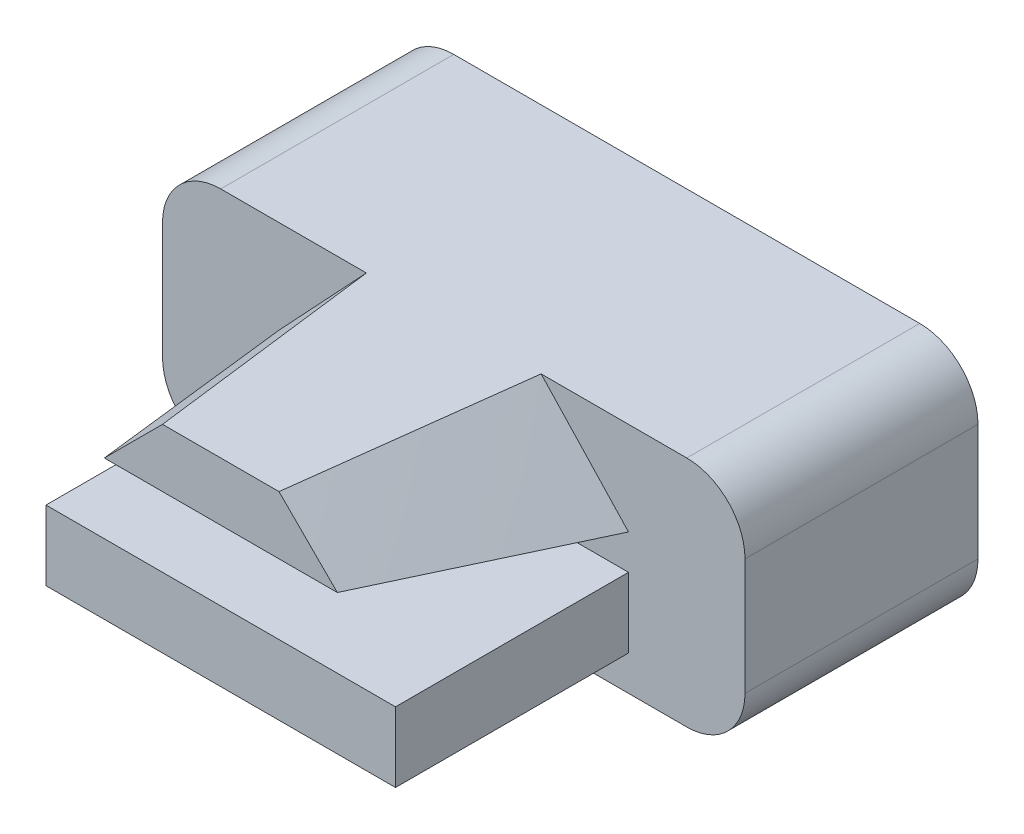
ISO-10303-21;
HEADER;
FILE_DESCRIPTION(('STEP AP214'),'2;1');
FILE_NAME('part.step','',(''),(''),'','','');
FILE_SCHEMA(('AUTOMOTIVE_DESIGN { 1 0 10303 214 1 1 1 1 }'));
ENDSEC;
DATA;
#1=APPLICATION_CONTEXT('core data for automotive mechanical design processes');
#2=APPLICATION_PROTOCOL_DEFINITION('international standard','automotive_design',2000,#1);
#3=PRODUCT_CONTEXT('',#1,'mechanical');
#4=PRODUCT('Part','Part','',(#3));
#5=PRODUCT_RELATED_PRODUCT_CATEGORY('part','',(#4));
#6=PRODUCT_DEFINITION_FORMATION('','',#4);
#7=PRODUCT_DEFINITION_CONTEXT('part definition',#1,'design');
#8=PRODUCT_DEFINITION('design','',#6,#7);
#9=PRODUCT_DEFINITION_SHAPE('','',#8);
#10=(LENGTH_UNIT() NAMED_UNIT(*) SI_UNIT(.MILLI.,.METRE.));
#11=(NAMED_UNIT(*) PLANE_ANGLE_UNIT() SI_UNIT($,.RADIAN.));
#12=(NAMED_UNIT(*) SI_UNIT($,.STERADIAN.) SOLID_ANGLE_UNIT());
#13=UNCERTAINTY_MEASURE_WITH_UNIT(LENGTH_MEASURE(1.E-05),#10,'distance_accuracy_value','');
#14=(GEOMETRIC_REPRESENTATION_CONTEXT(3) GLOBAL_UNCERTAINTY_ASSIGNED_CONTEXT((#13)) GLOBAL_UNIT_ASSIGNED_CONTEXT((#10,
#11,#12)) REPRESENTATION_CONTEXT('',''));
#15=CARTESIAN_POINT('',(0.,0.,0.));
#16=DIRECTION('',(0.,0.,1.));
#17=DIRECTION('',(1.,0.,0.));
#18=AXIS2_PLACEMENT_3D('',#15,#16,#17);
#19=CARTESIAN_POINT('',(0.,0.,20.));
#20=DIRECTION('',(0.,0.,1.));
#21=DIRECTION('',(1.,0.,0.));
#22=AXIS2_PLACEMENT_3D('',#19,#20,#21);
#23=PLANE('',#22);
#24=DIRECTION('',(-1.,0.,0.));
#25=VECTOR('',#24,1.);
#26=CARTESIAN_POINT('',(-15.,-1.,20.));
#27=LINE('',#26,#25);
#28=CARTESIAN_POINT('',(15.,-1.,20.));
#29=VERTEX_POINT('',#28);
#30=CARTESIAN_POINT('',(-15.,-1.,20.));
#31=VERTEX_POINT('',#30);
#32=EDGE_CURVE('E406',#29,#31,#27,.T.);
#33=ORIENTED_EDGE('',*,*,#32,.F.);
#34=DIRECTION('',(0.,1.,0.));
#35=VECTOR('',#34,1.);
#36=CARTESIAN_POINT('',(15.,-1.,20.));
#37=LINE('',#36,#35);
#38=CARTESIAN_POINT('',(15.,-7.,20.));
#39=VERTEX_POINT('',#38);
#40=EDGE_CURVE('E409',#39,#29,#37,.T.);
#41=ORIENTED_EDGE('',*,*,#40,.F.);
#42=DIRECTION('',(1.,0.,0.));
#43=VECTOR('',#42,1.);
#44=CARTESIAN_POINT('',(-15.,-7.,20.));
#45=LINE('',#44,#43);
#46=CARTESIAN_POINT('',(-15.,-7.,20.));
#47=VERTEX_POINT('',#46);
#48=EDGE_CURVE('E398',#47,#39,#45,.T.);
#49=ORIENTED_EDGE('',*,*,#48,.F.);
#50=DIRECTION('',(0.,-1.,0.));
#51=VECTOR('',#50,1.);
#52=CARTESIAN_POINT('',(-15.,-1.,20.));
#53=LINE('',#52,#51);
#54=EDGE_CURVE('E402',#31,#47,#53,.T.);
#55=ORIENTED_EDGE('',*,*,#54,.F.);
#56=EDGE_LOOP('',(#33,#41,#49,#55));
#57=FACE_BOUND('',#56,.T.);
#58=DIRECTION('',(0.,-1.,0.));
#59=VECTOR('',#58,1.);
#60=CARTESIAN_POINT('',(-25.,10.,20.));
#61=LINE('',#60,#59);
#62=CARTESIAN_POINT('',(-25.,5.,20.));
#63=VERTEX_POINT('',#62);
#64=CARTESIAN_POINT('',(-25.,-5.,20.));
#65=VERTEX_POINT('',#64);
#66=EDGE_CURVE('E276',#63,#65,#61,.T.);
#67=ORIENTED_EDGE('',*,*,#66,.T.);
#68=CARTESIAN_POINT('',(-20.,-5.,20.));
#69=DIRECTION('',(0.,0.,1.));
#70=DIRECTION('',(1.,0.,0.));
#71=AXIS2_PLACEMENT_3D('',#68,#69,#70);
#72=CIRCLE('',#71,5.);
#73=CARTESIAN_POINT('',(-20.,-10.,20.));
#74=VERTEX_POINT('',#73);
#75=EDGE_CURVE('E364',#65,#74,#72,.T.);
#76=ORIENTED_EDGE('',*,*,#75,.T.);
#77=DIRECTION('',(1.,0.,0.));
#78=VECTOR('',#77,1.);
#79=CARTESIAN_POINT('',(-25.,-10.,20.));
#80=LINE('',#79,#78);
#81=CARTESIAN_POINT('',(20.,-10.,20.));
#82=VERTEX_POINT('',#81);
#83=EDGE_CURVE('E250',#74,#82,#80,.T.);
#84=ORIENTED_EDGE('',*,*,#83,.T.);
#85=CARTESIAN_POINT('',(20.,-5.,20.));
#86=DIRECTION('',(0.,0.,1.));
#87=DIRECTION('',(1.,0.,0.));
#88=AXIS2_PLACEMENT_3D('',#85,#86,#87);
#89=CIRCLE('',#88,5.);
#90=CARTESIAN_POINT('',(25.,-5.,20.));
#91=VERTEX_POINT('',#90);
#92=EDGE_CURVE('E703',#82,#91,#89,.T.);
#93=ORIENTED_EDGE('',*,*,#92,.T.);
#94=DIRECTION('',(0.,1.,0.));
#95=VECTOR('',#94,1.);
#96=CARTESIAN_POINT('',(25.,10.,20.));
#97=LINE('',#96,#95);
#98=CARTESIAN_POINT('',(25.,5.,20.));
#99=VERTEX_POINT('',#98);
#100=EDGE_CURVE('E282',#91,#99,#97,.T.);
#101=ORIENTED_EDGE('',*,*,#100,.T.);
#102=CARTESIAN_POINT('',(20.,5.,20.));
#103=DIRECTION('',(0.,0.,1.));
#104=DIRECTION('',(1.,0.,0.));
#105=AXIS2_PLACEMENT_3D('',#102,#103,#104);
#106=CIRCLE('',#105,5.);
#107=CARTESIAN_POINT('',(20.,10.,20.));
#108=VERTEX_POINT('',#107);
#109=EDGE_CURVE('E112',#99,#108,#106,.T.);
#110=ORIENTED_EDGE('',*,*,#109,.T.);
#111=DIRECTION('',(-1.,0.,0.));
#112=VECTOR('',#111,1.);
#113=CARTESIAN_POINT('',(-25.,10.,20.));
#114=LINE('',#113,#112);
#115=CARTESIAN_POINT('',(7.5,10.,20.));
#116=VERTEX_POINT('',#115);
#117=EDGE_CURVE('E235',#108,#116,#114,.T.);
#118=ORIENTED_EDGE('',*,*,#117,.T.);
#119=DIRECTION('',(-0.68394112888133,0.729537204140085,0.));
#120=VECTOR('',#119,1.);
#121=CARTESIAN_POINT('',(7.5,10.,20.));
#122=LINE('',#121,#120);
#123=CARTESIAN_POINT('',(15.,2.00000000000001,20.));
#124=VERTEX_POINT('',#123);
#125=EDGE_CURVE('E215',#124,#116,#122,.T.);
#126=ORIENTED_EDGE('',*,*,#125,.F.);
#127=DIRECTION('',(1.,0.,0.));
#128=VECTOR('',#127,1.);
#129=CARTESIAN_POINT('',(15.,2.00000000000001,20.));
#130=LINE('',#129,#128);
#131=CARTESIAN_POINT('',(-15.,2.00000000000001,20.));
#132=VERTEX_POINT('',#131);
#133=EDGE_CURVE('E227',#132,#124,#130,.T.);
#134=ORIENTED_EDGE('',*,*,#133,.F.);
#135=DIRECTION('',(-0.68394112888133,-0.729537204140085,0.));
#136=VECTOR('',#135,1.);
#137=CARTESIAN_POINT('',(-15.,2.00000000000001,20.));
#138=LINE('',#137,#136);
#139=CARTESIAN_POINT('',(-7.5,10.,20.));
#140=VERTEX_POINT('',#139);
#141=EDGE_CURVE('E237',#140,#132,#138,.T.);
#142=ORIENTED_EDGE('',*,*,#141,.F.);
#143=CARTESIAN_POINT('',(-20.,10.,20.));
#144=VERTEX_POINT('',#143);
#145=EDGE_CURVE('E277',#140,#144,#114,.T.);
#146=ORIENTED_EDGE('',*,*,#145,.T.);
#147=CARTESIAN_POINT('',(-20.,5.,20.));
#148=DIRECTION('',(0.,0.,1.));
#149=DIRECTION('',(1.,0.,0.));
#150=AXIS2_PLACEMENT_3D('',#147,#148,#149);
#151=CIRCLE('',#150,5.);
#152=EDGE_CURVE('E701',#144,#63,#151,.T.);
#153=ORIENTED_EDGE('',*,*,#152,.T.);
#154=EDGE_LOOP('',(#67,#76,#84,#93,#101,#110,#118,#126,#134,#142,#146,#153));
#155=FACE_BOUND('',#154,.T.);
#156=ADVANCED_FACE('F96',(#57,#155),#23,.T.);
#157=CARTESIAN_POINT('',(25.,10.,20.));
#158=DIRECTION('',(-1.,0.,0.));
#159=DIRECTION('',(0.,0.,1.));
#160=AXIS2_PLACEMENT_3D('',#157,#158,#159);
#161=PLANE('',#160);
#162=ORIENTED_EDGE('',*,*,#100,.F.);
#163=DIRECTION('',(0.,0.,-1.));
#164=VECTOR('',#163,1.);
#165=CARTESIAN_POINT('',(25.,-5.,20.));
#166=LINE('',#165,#164);
#167=CARTESIAN_POINT('',(25.,-5.,0.));
#168=VERTEX_POINT('',#167);
#169=EDGE_CURVE('E13',#91,#168,#166,.T.);
#170=ORIENTED_EDGE('',*,*,#169,.T.);
#171=DIRECTION('',(0.,1.,0.));
#172=VECTOR('',#171,1.);
#173=CARTESIAN_POINT('',(25.,10.,0.));
#174=LINE('',#173,#172);
#175=CARTESIAN_POINT('',(25.,5.,0.));
#176=VERTEX_POINT('',#175);
#177=EDGE_CURVE('E375',#168,#176,#174,.T.);
#178=ORIENTED_EDGE('',*,*,#177,.T.);
#179=DIRECTION('',(0.,0.,-1.));
#180=VECTOR('',#179,1.);
#181=CARTESIAN_POINT('',(25.,5.,20.));
#182=LINE('',#181,#180);
#183=EDGE_CURVE('E105',#176,#99,#182,.F.);
#184=ORIENTED_EDGE('',*,*,#183,.T.);
#185=EDGE_LOOP('',(#162,#170,#178,#184));
#186=FACE_BOUND('',#185,.T.);
#187=ADVANCED_FACE('F314',(#186),#161,.F.);
#188=CARTESIAN_POINT('',(-25.,10.,20.));
#189=DIRECTION('',(0.,-1.,0.));
#190=DIRECTION('',(0.,0.,-1.));
#191=AXIS2_PLACEMENT_3D('',#188,#189,#190);
#192=PLANE('',#191);
#193=DIRECTION('',(-1.,0.,0.));
#194=VECTOR('',#193,1.);
#195=CARTESIAN_POINT('',(-25.,10.,0.));
#196=LINE('',#195,#194);
#197=CARTESIAN_POINT('',(20.,10.,0.));
#198=VERTEX_POINT('',#197);
#199=CARTESIAN_POINT('',(-20.,10.,0.));
#200=VERTEX_POINT('',#199);
#201=EDGE_CURVE('E371',#198,#200,#196,.T.);
#202=ORIENTED_EDGE('',*,*,#201,.T.);
#203=DIRECTION('',(0.,0.,-1.));
#204=VECTOR('',#203,1.);
#205=CARTESIAN_POINT('',(-20.,10.,20.));
#206=LINE('',#205,#204);
#207=EDGE_CURVE('E689',#200,#144,#206,.F.);
#208=ORIENTED_EDGE('',*,*,#207,.T.);
#209=ORIENTED_EDGE('',*,*,#145,.F.);
#210=CARTESIAN_POINT('',(-7.5,10.,20.));
#211=CARTESIAN_POINT('',(-6.66666666666667,10.,26.6666666666667));
#212=CARTESIAN_POINT('',(-5.83333333333333,10.,33.3333333333333));
#213=CARTESIAN_POINT('',(-5.,10.,40.));
#214=B_SPLINE_CURVE_WITH_KNOTS('',3,(#210,#211,#212,#213),.UNSPECIFIED.,.F.,.F.,(4,4),(0.,1.),.UNSPECIFIED.);
#215=CARTESIAN_POINT('',(-5.,10.,40.));
#216=VERTEX_POINT('',#215);
#217=EDGE_CURVE('E639',#140,#216,#214,.T.);
#218=ORIENTED_EDGE('',*,*,#217,.T.);
#219=DIRECTION('',(-1.,0.,0.));
#220=VECTOR('',#219,1.);
#221=CARTESIAN_POINT('',(5.,10.,40.));
#222=LINE('',#221,#220);
#223=CARTESIAN_POINT('',(5.,10.,40.));
#224=VERTEX_POINT('',#223);
#225=EDGE_CURVE('E299',#224,#216,#222,.T.);
#226=ORIENTED_EDGE('',*,*,#225,.F.);
#227=CARTESIAN_POINT('',(7.5,10.,20.));
#228=CARTESIAN_POINT('',(6.66666666666667,10.,26.6666666666667));
#229=CARTESIAN_POINT('',(5.83333333333333,10.,33.3333333333333));
#230=CARTESIAN_POINT('',(5.,10.,40.));
#231=B_SPLINE_CURVE_WITH_KNOTS('',3,(#227,#228,#229,#230),.UNSPECIFIED.,.F.,.F.,(4,4),(0.,1.),.UNSPECIFIED.);
#232=EDGE_CURVE('E223',#116,#224,#231,.T.);
#233=ORIENTED_EDGE('',*,*,#232,.F.);
#234=ORIENTED_EDGE('',*,*,#117,.F.);
#235=DIRECTION('',(0.,0.,-1.));
#236=VECTOR('',#235,1.);
#237=CARTESIAN_POINT('',(20.,10.,20.));
#238=LINE('',#237,#236);
#239=EDGE_CURVE('E693',#108,#198,#238,.T.);
#240=ORIENTED_EDGE('',*,*,#239,.T.);
#241=EDGE_LOOP('',(#202,#208,#209,#218,#226,#233,#234,#240));
#242=FACE_BOUND('',#241,.T.);
#243=ADVANCED_FACE('F303',(#242),#192,.F.);
#244=CARTESIAN_POINT('',(-25.,10.,20.));
#245=DIRECTION('',(1.,0.,0.));
#246=DIRECTION('',(0.,0.,-1.));
#247=AXIS2_PLACEMENT_3D('',#244,#245,#246);
#248=PLANE('',#247);
#249=DIRECTION('',(0.,-1.,0.));
#250=VECTOR('',#249,1.);
#251=CARTESIAN_POINT('',(-25.,10.,0.));
#252=LINE('',#251,#250);
#253=CARTESIAN_POINT('',(-25.,5.,0.));
#254=VERTEX_POINT('',#253);
#255=CARTESIAN_POINT('',(-25.,-5.,0.));
#256=VERTEX_POINT('',#255);
#257=EDGE_CURVE('E367',#254,#256,#252,.T.);
#258=ORIENTED_EDGE('',*,*,#257,.T.);
#259=DIRECTION('',(0.,0.,-1.));
#260=VECTOR('',#259,1.);
#261=CARTESIAN_POINT('',(-25.,-5.,20.));
#262=LINE('',#261,#260);
#263=EDGE_CURVE('E270',#256,#65,#262,.F.);
#264=ORIENTED_EDGE('',*,*,#263,.T.);
#265=ORIENTED_EDGE('',*,*,#66,.F.);
#266=DIRECTION('',(0.,0.,-1.));
#267=VECTOR('',#266,1.);
#268=CARTESIAN_POINT('',(-25.,5.,20.));
#269=LINE('',#268,#267);
#270=EDGE_CURVE('E266',#63,#254,#269,.T.);
#271=ORIENTED_EDGE('',*,*,#270,.T.);
#272=EDGE_LOOP('',(#258,#264,#265,#271));
#273=FACE_BOUND('',#272,.T.);
#274=ADVANCED_FACE('F313',(#273),#248,.F.);
#275=CARTESIAN_POINT('',(-25.,-10.,20.));
#276=DIRECTION('',(0.,1.,0.));
#277=DIRECTION('',(0.,0.,1.));
#278=AXIS2_PLACEMENT_3D('',#275,#276,#277);
#279=PLANE('',#278);
#280=ORIENTED_EDGE('',*,*,#83,.F.);
#281=DIRECTION('',(0.,0.,-1.));
#282=VECTOR('',#281,1.);
#283=CARTESIAN_POINT('',(-20.,-10.,20.));
#284=LINE('',#283,#282);
#285=CARTESIAN_POINT('',(-20.,-10.,0.));
#286=VERTEX_POINT('',#285);
#287=EDGE_CURVE('E249',#74,#286,#284,.T.);
#288=ORIENTED_EDGE('',*,*,#287,.T.);
#289=DIRECTION('',(1.,0.,0.));
#290=VECTOR('',#289,1.);
#291=CARTESIAN_POINT('',(-25.,-10.,0.));
#292=LINE('',#291,#290);
#293=CARTESIAN_POINT('',(20.,-10.,0.));
#294=VERTEX_POINT('',#293);
#295=EDGE_CURVE('E290',#286,#294,#292,.T.);
#296=ORIENTED_EDGE('',*,*,#295,.T.);
#297=DIRECTION('',(0.,0.,-1.));
#298=VECTOR('',#297,1.);
#299=CARTESIAN_POINT('',(20.,-10.,20.));
#300=LINE('',#299,#298);
#301=EDGE_CURVE('E246',#294,#82,#300,.F.);
#302=ORIENTED_EDGE('',*,*,#301,.T.);
#303=EDGE_LOOP('',(#280,#288,#296,#302));
#304=FACE_BOUND('',#303,.T.);
#305=ADVANCED_FACE('F347',(#304),#279,.F.);
#306=CARTESIAN_POINT('',(0.,0.,0.));
#307=DIRECTION('',(0.,0.,1.));
#308=DIRECTION('',(1.,0.,0.));
#309=AXIS2_PLACEMENT_3D('',#306,#307,#308);
#310=PLANE('',#309);
#311=ORIENTED_EDGE('',*,*,#295,.F.);
#312=CARTESIAN_POINT('',(-20.,-5.,0.));
#313=DIRECTION('',(0.,0.,1.));
#314=DIRECTION('',(1.,0.,0.));
#315=AXIS2_PLACEMENT_3D('',#312,#313,#314);
#316=CIRCLE('',#315,5.);
#317=EDGE_CURVE('E263',#286,#256,#316,.F.);
#318=ORIENTED_EDGE('',*,*,#317,.T.);
#319=ORIENTED_EDGE('',*,*,#257,.F.);
#320=CARTESIAN_POINT('',(-20.,5.,0.));
#321=DIRECTION('',(0.,0.,1.));
#322=DIRECTION('',(1.,0.,0.));
#323=AXIS2_PLACEMENT_3D('',#320,#321,#322);
#324=CIRCLE('',#323,5.);
#325=EDGE_CURVE('E260',#254,#200,#324,.F.);
#326=ORIENTED_EDGE('',*,*,#325,.T.);
#327=ORIENTED_EDGE('',*,*,#201,.F.);
#328=CARTESIAN_POINT('',(20.,5.,0.));
#329=DIRECTION('',(0.,0.,1.));
#330=DIRECTION('',(1.,0.,0.));
#331=AXIS2_PLACEMENT_3D('',#328,#329,#330);
#332=CIRCLE('',#331,5.);
#333=EDGE_CURVE('E254',#198,#176,#332,.F.);
#334=ORIENTED_EDGE('',*,*,#333,.T.);
#335=ORIENTED_EDGE('',*,*,#177,.F.);
#336=CARTESIAN_POINT('',(20.,-5.,0.));
#337=DIRECTION('',(0.,0.,1.));
#338=DIRECTION('',(1.,0.,0.));
#339=AXIS2_PLACEMENT_3D('',#336,#337,#338);
#340=CIRCLE('',#339,5.);
#341=EDGE_CURVE('E257',#168,#294,#340,.F.);
#342=ORIENTED_EDGE('',*,*,#341,.T.);
#343=EDGE_LOOP('',(#311,#318,#319,#326,#327,#334,#335,#342));
#344=FACE_BOUND('',#343,.T.);
#345=ADVANCED_FACE('F345',(#344),#310,.F.);
#346=CARTESIAN_POINT('',(15.,-1.,40.));
#347=DIRECTION('',(-1.,0.,0.));
#348=DIRECTION('',(0.,0.,1.));
#349=AXIS2_PLACEMENT_3D('',#346,#347,#348);
#350=PLANE('',#349);
#351=ORIENTED_EDGE('',*,*,#40,.T.);
#352=DIRECTION('',(0.,0.,-1.));
#353=VECTOR('',#352,1.);
#354=CARTESIAN_POINT('',(15.,-1.,40.));
#355=LINE('',#354,#353);
#356=CARTESIAN_POINT('',(15.,-1.,40.));
#357=VERTEX_POINT('',#356);
#358=EDGE_CURVE('E379',#357,#29,#355,.T.);
#359=ORIENTED_EDGE('',*,*,#358,.F.);
#360=DIRECTION('',(0.,1.,0.));
#361=VECTOR('',#360,1.);
#362=CARTESIAN_POINT('',(15.,-1.,40.));
#363=LINE('',#362,#361);
#364=CARTESIAN_POINT('',(15.,-7.,40.));
#365=VERTEX_POINT('',#364);
#366=EDGE_CURVE('E401',#365,#357,#363,.T.);
#367=ORIENTED_EDGE('',*,*,#366,.F.);
#368=DIRECTION('',(0.,0.,-1.));
#369=VECTOR('',#368,1.);
#370=CARTESIAN_POINT('',(15.,-7.,40.));
#371=LINE('',#370,#369);
#372=EDGE_CURVE('E393',#365,#39,#371,.T.);
#373=ORIENTED_EDGE('',*,*,#372,.T.);
#374=EDGE_LOOP('',(#351,#359,#367,#373));
#375=FACE_BOUND('',#374,.T.);
#376=ADVANCED_FACE('F343',(#375),#350,.F.);
#377=CARTESIAN_POINT('',(-15.,-1.,40.));
#378=DIRECTION('',(0.,-1.,0.));
#379=DIRECTION('',(0.,0.,-1.));
#380=AXIS2_PLACEMENT_3D('',#377,#378,#379);
#381=PLANE('',#380);
#382=ORIENTED_EDGE('',*,*,#32,.T.);
#383=DIRECTION('',(0.,0.,-1.));
#384=VECTOR('',#383,1.);
#385=CARTESIAN_POINT('',(-15.,-1.,40.));
#386=LINE('',#385,#384);
#387=CARTESIAN_POINT('',(-15.,-1.,40.));
#388=VERTEX_POINT('',#387);
#389=EDGE_CURVE('E382',#388,#31,#386,.T.);
#390=ORIENTED_EDGE('',*,*,#389,.F.);
#391=DIRECTION('',(-1.,0.,0.));
#392=VECTOR('',#391,1.);
#393=CARTESIAN_POINT('',(-15.,-1.,40.));
#394=LINE('',#393,#392);
#395=EDGE_CURVE('E417',#357,#388,#394,.T.);
#396=ORIENTED_EDGE('',*,*,#395,.F.);
#397=ORIENTED_EDGE('',*,*,#358,.T.);
#398=EDGE_LOOP('',(#382,#390,#396,#397));
#399=FACE_BOUND('',#398,.T.);
#400=ADVANCED_FACE('F450',(#399),#381,.F.);
#401=CARTESIAN_POINT('',(-15.,-1.,40.));
#402=DIRECTION('',(1.,0.,0.));
#403=DIRECTION('',(0.,0.,-1.));
#404=AXIS2_PLACEMENT_3D('',#401,#402,#403);
#405=PLANE('',#404);
#406=ORIENTED_EDGE('',*,*,#54,.T.);
#407=DIRECTION('',(0.,0.,-1.));
#408=VECTOR('',#407,1.);
#409=CARTESIAN_POINT('',(-15.,-7.,40.));
#410=LINE('',#409,#408);
#411=CARTESIAN_POINT('',(-15.,-7.,40.));
#412=VERTEX_POINT('',#411);
#413=EDGE_CURVE('E388',#412,#47,#410,.T.);
#414=ORIENTED_EDGE('',*,*,#413,.F.);
#415=DIRECTION('',(0.,-1.,0.));
#416=VECTOR('',#415,1.);
#417=CARTESIAN_POINT('',(-15.,-1.,40.));
#418=LINE('',#417,#416);
#419=EDGE_CURVE('E414',#388,#412,#418,.T.);
#420=ORIENTED_EDGE('',*,*,#419,.F.);
#421=ORIENTED_EDGE('',*,*,#389,.T.);
#422=EDGE_LOOP('',(#406,#414,#420,#421));
#423=FACE_BOUND('',#422,.T.);
#424=ADVANCED_FACE('F447',(#423),#405,.F.);
#425=CARTESIAN_POINT('',(-15.,-7.,40.));
#426=DIRECTION('',(0.,1.,0.));
#427=DIRECTION('',(0.,0.,1.));
#428=AXIS2_PLACEMENT_3D('',#425,#426,#427);
#429=PLANE('',#428);
#430=ORIENTED_EDGE('',*,*,#48,.T.);
#431=ORIENTED_EDGE('',*,*,#372,.F.);
#432=DIRECTION('',(1.,0.,0.));
#433=VECTOR('',#432,1.);
#434=CARTESIAN_POINT('',(-15.,-7.,40.));
#435=LINE('',#434,#433);
#436=EDGE_CURVE('E397',#412,#365,#435,.T.);
#437=ORIENTED_EDGE('',*,*,#436,.F.);
#438=ORIENTED_EDGE('',*,*,#413,.T.);
#439=EDGE_LOOP('',(#430,#431,#437,#438));
#440=FACE_BOUND('',#439,.T.);
#441=ADVANCED_FACE('F443',(#440),#429,.F.);
#442=CARTESIAN_POINT('',(0.,0.,40.));
#443=DIRECTION('',(0.,0.,1.));
#444=DIRECTION('',(1.,0.,0.));
#445=AXIS2_PLACEMENT_3D('',#442,#443,#444);
#446=PLANE('',#445);
#447=ORIENTED_EDGE('',*,*,#366,.T.);
#448=ORIENTED_EDGE('',*,*,#395,.T.);
#449=ORIENTED_EDGE('',*,*,#419,.T.);
#450=ORIENTED_EDGE('',*,*,#436,.T.);
#451=EDGE_LOOP('',(#447,#448,#449,#450));
#452=FACE_BOUND('',#451,.T.);
#453=ADVANCED_FACE('F440',(#452),#446,.T.);
#454=CARTESIAN_POINT('',(0.,0.,40.));
#455=DIRECTION('',(0.,0.,1.));
#456=DIRECTION('',(1.,0.,0.));
#457=AXIS2_PLACEMENT_3D('',#454,#455,#456);
#458=PLANE('',#457);
#459=DIRECTION('',(-0.7067442704124,-0.707469106208352,0.));
#460=VECTOR('',#459,1.);
#461=CARTESIAN_POINT('',(-5.,10.,40.));
#462=LINE('',#461,#460);
#463=CARTESIAN_POINT('',(-9.99487726185079,5.,40.));
#464=VERTEX_POINT('',#463);
#465=EDGE_CURVE('E627',#216,#464,#462,.T.);
#466=ORIENTED_EDGE('',*,*,#465,.T.);
#467=DIRECTION('',(1.,0.,0.));
#468=VECTOR('',#467,1.);
#469=CARTESIAN_POINT('',(-9.99487726185079,5.,40.));
#470=LINE('',#469,#468);
#471=CARTESIAN_POINT('',(10.0051227381492,5.,40.));
#472=VERTEX_POINT('',#471);
#473=EDGE_CURVE('E617',#464,#472,#470,.T.);
#474=ORIENTED_EDGE('',*,*,#473,.T.);
#475=DIRECTION('',(-0.707468735274285,0.706744641726701,0.));
#476=VECTOR('',#475,1.);
#477=CARTESIAN_POINT('',(5.,10.,40.));
#478=LINE('',#477,#476);
#479=EDGE_CURVE('E218',#472,#224,#478,.T.);
#480=ORIENTED_EDGE('',*,*,#479,.T.);
#481=ORIENTED_EDGE('',*,*,#225,.T.);
#482=EDGE_LOOP('',(#466,#474,#480,#481));
#483=FACE_BOUND('',#482,.T.);
#484=ADVANCED_FACE('F437',(#483),#458,.T.);
#485=CARTESIAN_POINT('',(15.,2.00000000000001,20.));
#486=CARTESIAN_POINT('',(13.3350409127164,3.00000000000001,26.6666666666667));
#487=CARTESIAN_POINT('',(11.6700818254328,4.00000000000001,33.3333333333333));
#488=CARTESIAN_POINT('',(10.0051227381492,5.,40.));
#489=CARTESIAN_POINT('',(14.375,2.66666666666668,20.));
#490=CARTESIAN_POINT('',(12.7793430588789,3.58333333333334,26.6666666666667));
#491=CARTESIAN_POINT('',(11.1836861177578,4.50000000000001,33.3333333333333));
#492=CARTESIAN_POINT('',(9.58802917663678,5.41666666666667,40.));
#493=CARTESIAN_POINT('',(13.125,4.,20.));
#494=CARTESIAN_POINT('',(11.667947351204,4.75000000000001,26.6666666666667));
#495=CARTESIAN_POINT('',(10.2108947024079,5.50000000000001,33.3333333333334));
#496=CARTESIAN_POINT('',(8.75384205361191,6.25000000000001,40.));
#497=CARTESIAN_POINT('',(11.25,6.00000000000002,20.));
#498=CARTESIAN_POINT('',(10.0008537896915,6.50000000000002,26.6666666666666));
#499=CARTESIAN_POINT('',(8.75170757938307,7.00000000000001,33.3333333333333));
#500=CARTESIAN_POINT('',(7.5025613690746,7.5,40.));
#501=CARTESIAN_POINT('',(9.37499999999999,8.,20.));
#502=CARTESIAN_POINT('',(8.3337602281791,8.25,26.6666666666667));
#503=CARTESIAN_POINT('',(7.2925204563582,8.50000000000001,33.3333333333333));
#504=CARTESIAN_POINT('',(6.25128068453731,8.75000000000001,40.));
#505=CARTESIAN_POINT('',(8.125,9.33333333333334,20.));
#506=CARTESIAN_POINT('',(7.22236452050414,9.41666666666667,26.6666666666667));
#507=CARTESIAN_POINT('',(6.31972904100829,9.50000000000001,33.3333333333333));
#508=CARTESIAN_POINT('',(5.41709356151243,9.58333333333334,40.));
#509=CARTESIAN_POINT('',(7.5,10.,20.));
#510=CARTESIAN_POINT('',(6.66666666666667,10.,26.6666666666667));
#511=CARTESIAN_POINT('',(5.83333333333333,10.,33.3333333333333));
#512=CARTESIAN_POINT('',(5.,10.,40.));
#513=B_SPLINE_SURFACE_WITH_KNOTS('',3,3,((#485,#486,#487,#488),(#489,#490,#491,#492),(#493,#494,
#495,#496),(#497,#498,#499,#500),(#501,#502,#503,#504),(#505,#506,#507,#508),(#509,#510,#511,
#512)),.UNSPECIFIED.,.F.,.F.,.F.,(4,1,1,1,4),(4,4),(0.612621450725256,0.653134847575935,
0.693648244426613,0.734161641277291,0.77467503812797),(0.,1.),.UNSPECIFIED.);
#514=CARTESIAN_POINT('',(15.,2.00000000000001,20.));
#515=CARTESIAN_POINT('',(13.3350409127164,3.00000000000001,26.6666666666667));
#516=CARTESIAN_POINT('',(11.6700818254328,4.00000000000001,33.3333333333333));
#517=CARTESIAN_POINT('',(10.0051227381492,5.,40.));
#518=B_SPLINE_CURVE_WITH_KNOTS('',3,(#514,#515,#516,#517),.UNSPECIFIED.,.F.,.F.,(4,4),(0.,1.),.UNSPECIFIED.);
#519=EDGE_CURVE('E211',#124,#472,#518,.T.);
#520=ORIENTED_EDGE('',*,*,#125,.T.);
#521=ORIENTED_EDGE('',*,*,#232,.T.);
#522=ORIENTED_EDGE('',*,*,#479,.F.);
#523=ORIENTED_EDGE('',*,*,#519,.F.);
#524=EDGE_LOOP('',(#520,#521,#522,#523));
#525=FACE_BOUND('',#524,.T.);
#526=ADVANCED_FACE('F213',(#525),#513,.T.);
#527=CARTESIAN_POINT('',(-15.,2.00000000000001,20.));
#528=DIRECTION('',(0.,-0.988936352868298,0.148340452930244));
#529=DIRECTION('',(1.,0.,0.));
#530=AXIS2_PLACEMENT_3D('',#527,#528,#529);
#531=PLANE('',#530);
#532=ORIENTED_EDGE('',*,*,#133,.T.);
#533=ORIENTED_EDGE('',*,*,#519,.T.);
#534=ORIENTED_EDGE('',*,*,#473,.F.);
#535=CARTESIAN_POINT('',(-15.,2.00000000000001,20.));
#536=CARTESIAN_POINT('',(-13.3316257539503,3.,26.6666666666667));
#537=CARTESIAN_POINT('',(-11.6632515079005,4.,33.3333333333333));
#538=CARTESIAN_POINT('',(-9.99487726185079,5.,40.));
#539=B_SPLINE_CURVE_WITH_KNOTS('',3,(#535,#536,#537,#538),.UNSPECIFIED.,.F.,.F.,(4,4),(0.,1.),.UNSPECIFIED.);
#540=EDGE_CURVE('E224',#132,#464,#539,.T.);
#541=ORIENTED_EDGE('',*,*,#540,.F.);
#542=EDGE_LOOP('',(#532,#533,#534,#541));
#543=FACE_BOUND('',#542,.T.);
#544=ADVANCED_FACE('F228',(#543),#531,.T.);
#545=CARTESIAN_POINT('',(-7.5,10.,20.));
#546=CARTESIAN_POINT('',(-6.66666666666667,10.,26.6666666666667));
#547=CARTESIAN_POINT('',(-5.83333333333333,10.,33.3333333333333));
#548=CARTESIAN_POINT('',(-5.,10.,40.));
#549=CARTESIAN_POINT('',(-8.125,9.33333333333334,20.));
#550=CARTESIAN_POINT('',(-7.2220799239403,9.41666666666667,26.6666666666667));
#551=CARTESIAN_POINT('',(-6.3191598478806,9.5,33.3333333333333));
#552=CARTESIAN_POINT('',(-5.4162397718209,9.58333333333333,40.));
#553=CARTESIAN_POINT('',(-9.37499999999999,8.,20.));
#554=CARTESIAN_POINT('',(-8.33290643848756,8.25,26.6666666666667));
#555=CARTESIAN_POINT('',(-7.29081287697513,8.5,33.3333333333333));
#556=CARTESIAN_POINT('',(-6.2487193154627,8.75,40.));
#557=CARTESIAN_POINT('',(-11.25,6.00000000000001,20.));
#558=CARTESIAN_POINT('',(-9.99914621030848,6.50000000000001,26.6666666666667));
#559=CARTESIAN_POINT('',(-8.74829242061694,7.00000000000001,33.3333333333334));
#560=CARTESIAN_POINT('',(-7.49743863092541,7.50000000000001,40.));
#561=CARTESIAN_POINT('',(-13.125,4.,20.));
#562=CARTESIAN_POINT('',(-11.6653859821294,4.75,26.6666666666666));
#563=CARTESIAN_POINT('',(-10.2057719642587,5.5,33.3333333333333));
#564=CARTESIAN_POINT('',(-8.74615794638808,6.25,40.));
#565=CARTESIAN_POINT('',(-14.375,2.66666666666667,20.));
#566=CARTESIAN_POINT('',(-12.7762124966766,3.58333333333334,26.6666666666667));
#567=CARTESIAN_POINT('',(-11.1774249933533,4.5,33.3333333333333));
#568=CARTESIAN_POINT('',(-9.57863749002989,5.41666666666667,40.));
#569=CARTESIAN_POINT('',(-15.,2.00000000000001,20.));
#570=CARTESIAN_POINT('',(-13.3316257539503,3.,26.6666666666667));
#571=CARTESIAN_POINT('',(-11.6632515079005,4.,33.3333333333333));
#572=CARTESIAN_POINT('',(-9.99487726185079,5.,40.));
#573=B_SPLINE_SURFACE_WITH_KNOTS('',3,3,((#545,#546,#547,#548),(#549,#550,#551,#552),(#553,#554,
#555,#556),(#557,#558,#559,#560),(#561,#562,#563,#564),(#565,#566,#567,#568),(#569,#570,#571,
#572)),.UNSPECIFIED.,.F.,.F.,.F.,(4,1,1,1,4),(4,4),(0.,0.0404928817452989,0.0809857634905978,
0.121478645235897,0.161971526981196),(0.,1.),.UNSPECIFIED.);
#574=ORIENTED_EDGE('',*,*,#141,.T.);
#575=ORIENTED_EDGE('',*,*,#540,.T.);
#576=ORIENTED_EDGE('',*,*,#465,.F.);
#577=ORIENTED_EDGE('',*,*,#217,.F.);
#578=EDGE_LOOP('',(#574,#575,#576,#577));
#579=FACE_BOUND('',#578,.T.);
#580=ADVANCED_FACE('F322',(#579),#573,.T.);
#581=CARTESIAN_POINT('',(-20.,-5.,20.));
#582=DIRECTION('',(0.,0.,-1.));
#583=DIRECTION('',(-1.,0.,0.));
#584=AXIS2_PLACEMENT_3D('',#581,#582,#583);
#585=CYLINDRICAL_SURFACE('',#584,5.);
#586=ORIENTED_EDGE('',*,*,#75,.F.);
#587=ORIENTED_EDGE('',*,*,#263,.F.);
#588=ORIENTED_EDGE('',*,*,#317,.F.);
#589=ORIENTED_EDGE('',*,*,#287,.F.);
#590=EDGE_LOOP('',(#586,#587,#588,#589));
#591=FACE_BOUND('',#590,.T.);
#592=ADVANCED_FACE('F318',(#591),#585,.T.);
#593=CARTESIAN_POINT('',(-20.,5.,20.));
#594=DIRECTION('',(0.,0.,-1.));
#595=DIRECTION('',(-1.,0.,0.));
#596=AXIS2_PLACEMENT_3D('',#593,#594,#595);
#597=CYLINDRICAL_SURFACE('',#596,5.);
#598=ORIENTED_EDGE('',*,*,#152,.F.);
#599=ORIENTED_EDGE('',*,*,#207,.F.);
#600=ORIENTED_EDGE('',*,*,#325,.F.);
#601=ORIENTED_EDGE('',*,*,#270,.F.);
#602=EDGE_LOOP('',(#598,#599,#600,#601));
#603=FACE_BOUND('',#602,.T.);
#604=ADVANCED_FACE('F321',(#603),#597,.T.);
#605=CARTESIAN_POINT('',(20.,-5.,20.));
#606=DIRECTION('',(0.,0.,-1.));
#607=DIRECTION('',(-1.,0.,0.));
#608=AXIS2_PLACEMENT_3D('',#605,#606,#607);
#609=CYLINDRICAL_SURFACE('',#608,5.);
#610=ORIENTED_EDGE('',*,*,#92,.F.);
#611=ORIENTED_EDGE('',*,*,#301,.F.);
#612=ORIENTED_EDGE('',*,*,#341,.F.);
#613=ORIENTED_EDGE('',*,*,#169,.F.);
#614=EDGE_LOOP('',(#610,#611,#612,#613));
#615=FACE_BOUND('',#614,.T.);
#616=ADVANCED_FACE('F325',(#615),#609,.T.);
#617=CARTESIAN_POINT('',(20.,5.,20.));
#618=DIRECTION('',(0.,0.,-1.));
#619=DIRECTION('',(-1.,0.,0.));
#620=AXIS2_PLACEMENT_3D('',#617,#618,#619);
#621=CYLINDRICAL_SURFACE('',#620,5.);
#622=ORIENTED_EDGE('',*,*,#109,.F.);
#623=ORIENTED_EDGE('',*,*,#183,.F.);
#624=ORIENTED_EDGE('',*,*,#333,.F.);
#625=ORIENTED_EDGE('',*,*,#239,.F.);
#626=EDGE_LOOP('',(#622,#623,#624,#625));
#627=FACE_BOUND('',#626,.T.);
#628=ADVANCED_FACE('F98',(#627),#621,.T.);
#629=CLOSED_SHELL('',(#156,#187,#243,#274,#305,#345,#376,#400,#424,#441,#453,#484,#526,#544,
#580,#592,#604,#616,#628));
#630=MANIFOLD_SOLID_BREP('B2',#629);
#631=ADVANCED_BREP_SHAPE_REPRESENTATION('',(#18,#630),#14);
#632=SHAPE_DEFINITION_REPRESENTATION(#9,#631);
ENDSEC;
END-ISO-10303-21;
